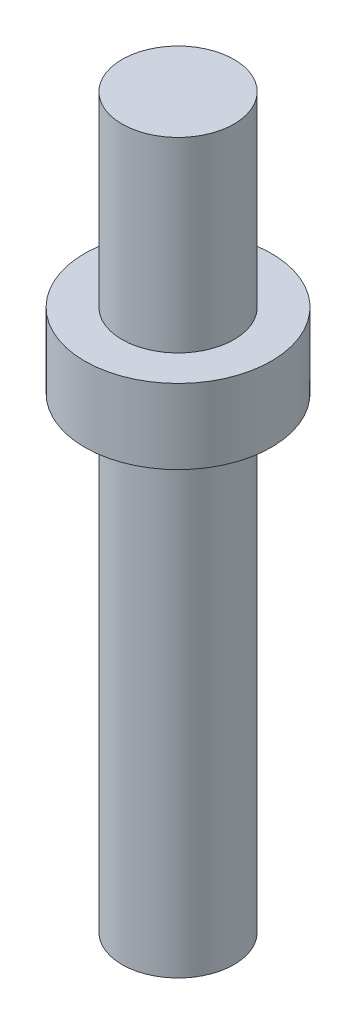
ISO-10303-21;
HEADER;
FILE_DESCRIPTION(('STEP AP214'),'2;1');
FILE_NAME('part.step','',(''),(''),'','','');
FILE_SCHEMA(('AUTOMOTIVE_DESIGN { 1 0 10303 214 1 1 1 1 }'));
ENDSEC;
DATA;
#1=APPLICATION_CONTEXT('core data for automotive mechanical design processes');
#2=APPLICATION_PROTOCOL_DEFINITION('international standard','automotive_design',2000,#1);
#3=PRODUCT_CONTEXT('',#1,'mechanical');
#4=PRODUCT('Part','Part','',(#3));
#5=PRODUCT_RELATED_PRODUCT_CATEGORY('part','',(#4));
#6=PRODUCT_DEFINITION_FORMATION('','',#4);
#7=PRODUCT_DEFINITION_CONTEXT('part definition',#1,'design');
#8=PRODUCT_DEFINITION('design','',#6,#7);
#9=PRODUCT_DEFINITION_SHAPE('','',#8);
#10=(LENGTH_UNIT() NAMED_UNIT(*) SI_UNIT(.MILLI.,.METRE.));
#11=(NAMED_UNIT(*) PLANE_ANGLE_UNIT() SI_UNIT($,.RADIAN.));
#12=(NAMED_UNIT(*) SI_UNIT($,.STERADIAN.) SOLID_ANGLE_UNIT());
#13=UNCERTAINTY_MEASURE_WITH_UNIT(LENGTH_MEASURE(1.E-05),#10,'distance_accuracy_value','');
#14=(GEOMETRIC_REPRESENTATION_CONTEXT(3) GLOBAL_UNCERTAINTY_ASSIGNED_CONTEXT((#13)) GLOBAL_UNIT_ASSIGNED_CONTEXT((#10,
#11,#12)) REPRESENTATION_CONTEXT('',''));
#15=CARTESIAN_POINT('',(0.,0.,0.));
#16=DIRECTION('',(0.,0.,1.));
#17=DIRECTION('',(1.,0.,0.));
#18=AXIS2_PLACEMENT_3D('',#15,#16,#17);
#19=CARTESIAN_POINT('',(0.,12.5,0.));
#20=DIRECTION('',(0.,-1.,0.));
#21=DIRECTION('',(0.,0.,-1.));
#22=AXIS2_PLACEMENT_3D('',#19,#20,#21);
#23=CYLINDRICAL_SURFACE('',#22,1.5);
#24=CARTESIAN_POINT('',(0.,12.5,0.));
#25=DIRECTION('',(0.,1.,0.));
#26=DIRECTION('',(0.,0.,1.));
#27=AXIS2_PLACEMENT_3D('',#24,#25,#26);
#28=CIRCLE('',#27,1.5);
#29=CARTESIAN_POINT('',(0.,12.5,1.5));
#30=VERTEX_POINT('',#29);
#31=EDGE_CURVE('E44',#30,#30,#28,.T.);
#32=ORIENTED_EDGE('',*,*,#31,.F.);
#33=EDGE_LOOP('',(#32));
#34=FACE_BOUND('',#33,.T.);
#35=CARTESIAN_POINT('',(0.,0.,0.));
#36=DIRECTION('',(0.,1.,0.));
#37=DIRECTION('',(0.,0.,1.));
#38=AXIS2_PLACEMENT_3D('',#35,#36,#37);
#39=CIRCLE('',#38,1.5);
#40=CARTESIAN_POINT('',(0.,0.,1.5));
#41=VERTEX_POINT('',#40);
#42=EDGE_CURVE('E40',#41,#41,#39,.T.);
#43=ORIENTED_EDGE('',*,*,#42,.T.);
#44=EDGE_LOOP('',(#43));
#45=FACE_BOUND('',#44,.T.);
#46=ADVANCED_FACE('F37',(#34,#45),#23,.T.);
#47=CARTESIAN_POINT('',(0.,0.,0.));
#48=DIRECTION('',(0.,1.,0.));
#49=DIRECTION('',(0.,0.,1.));
#50=AXIS2_PLACEMENT_3D('',#47,#48,#49);
#51=PLANE('',#50);
#52=ORIENTED_EDGE('',*,*,#42,.F.);
#53=EDGE_LOOP('',(#52));
#54=FACE_BOUND('',#53,.T.);
#55=ADVANCED_FACE('F79',(#54),#51,.F.);
#56=CARTESIAN_POINT('',(0.,14.5,0.));
#57=DIRECTION('',(0.,-1.,0.));
#58=DIRECTION('',(0.,0.,-1.));
#59=AXIS2_PLACEMENT_3D('',#56,#57,#58);
#60=CYLINDRICAL_SURFACE('',#59,2.5);
#61=CARTESIAN_POINT('',(0.,14.5,0.));
#62=DIRECTION('',(0.,1.,0.));
#63=DIRECTION('',(0.,0.,1.));
#64=AXIS2_PLACEMENT_3D('',#61,#62,#63);
#65=CIRCLE('',#64,2.5);
#66=CARTESIAN_POINT('',(0.,14.5,2.5));
#67=VERTEX_POINT('',#66);
#68=EDGE_CURVE('E52',#67,#67,#65,.T.);
#69=ORIENTED_EDGE('',*,*,#68,.F.);
#70=EDGE_LOOP('',(#69));
#71=FACE_BOUND('',#70,.T.);
#72=CARTESIAN_POINT('',(0.,12.5,0.));
#73=DIRECTION('',(0.,1.,0.));
#74=DIRECTION('',(0.,0.,1.));
#75=AXIS2_PLACEMENT_3D('',#72,#73,#74);
#76=CIRCLE('',#75,2.5);
#77=CARTESIAN_POINT('',(0.,12.5,2.5));
#78=VERTEX_POINT('',#77);
#79=EDGE_CURVE('E55',#78,#78,#76,.T.);
#80=ORIENTED_EDGE('',*,*,#79,.T.);
#81=EDGE_LOOP('',(#80));
#82=FACE_BOUND('',#81,.T.);
#83=ADVANCED_FACE('F84',(#71,#82),#60,.T.);
#84=CARTESIAN_POINT('',(0.,14.5,0.));
#85=DIRECTION('',(0.,1.,0.));
#86=DIRECTION('',(0.,0.,1.));
#87=AXIS2_PLACEMENT_3D('',#84,#85,#86);
#88=PLANE('',#87);
#89=CARTESIAN_POINT('',(0.,14.5,0.));
#90=DIRECTION('',(0.,1.,0.));
#91=DIRECTION('',(0.,0.,1.));
#92=AXIS2_PLACEMENT_3D('',#89,#90,#91);
#93=CIRCLE('',#92,1.5);
#94=CARTESIAN_POINT('',(0.,14.5,1.5));
#95=VERTEX_POINT('',#94);
#96=EDGE_CURVE('E10',#95,#95,#93,.T.);
#97=ORIENTED_EDGE('',*,*,#96,.F.);
#98=EDGE_LOOP('',(#97));
#99=FACE_BOUND('',#98,.T.);
#100=ORIENTED_EDGE('',*,*,#68,.T.);
#101=EDGE_LOOP('',(#100));
#102=FACE_BOUND('',#101,.T.);
#103=ADVANCED_FACE('F74',(#99,#102),#88,.T.);
#104=CARTESIAN_POINT('',(0.,12.5,0.));
#105=DIRECTION('',(0.,1.,0.));
#106=DIRECTION('',(0.,0.,1.));
#107=AXIS2_PLACEMENT_3D('',#104,#105,#106);
#108=PLANE('',#107);
#109=ORIENTED_EDGE('',*,*,#31,.T.);
#110=EDGE_LOOP('',(#109));
#111=FACE_BOUND('',#110,.T.);
#112=ORIENTED_EDGE('',*,*,#79,.F.);
#113=EDGE_LOOP('',(#112));
#114=FACE_BOUND('',#113,.T.);
#115=ADVANCED_FACE('F66',(#111,#114),#108,.F.);
#116=CARTESIAN_POINT('',(0.,19.5,0.));
#117=DIRECTION('',(0.,-1.,0.));
#118=DIRECTION('',(0.,0.,-1.));
#119=AXIS2_PLACEMENT_3D('',#116,#117,#118);
#120=CYLINDRICAL_SURFACE('',#119,1.5);
#121=CARTESIAN_POINT('',(0.,19.5,0.));
#122=DIRECTION('',(0.,1.,0.));
#123=DIRECTION('',(0.,0.,1.));
#124=AXIS2_PLACEMENT_3D('',#121,#122,#123);
#125=CIRCLE('',#124,1.5);
#126=CARTESIAN_POINT('',(0.,19.5,1.5));
#127=VERTEX_POINT('',#126);
#128=EDGE_CURVE('E51',#127,#127,#125,.T.);
#129=ORIENTED_EDGE('',*,*,#128,.F.);
#130=EDGE_LOOP('',(#129));
#131=FACE_BOUND('',#130,.T.);
#132=ORIENTED_EDGE('',*,*,#96,.T.);
#133=EDGE_LOOP('',(#132));
#134=FACE_BOUND('',#133,.T.);
#135=ADVANCED_FACE('F64',(#131,#134),#120,.T.);
#136=CARTESIAN_POINT('',(0.,19.5,0.));
#137=DIRECTION('',(0.,1.,0.));
#138=DIRECTION('',(0.,0.,1.));
#139=AXIS2_PLACEMENT_3D('',#136,#137,#138);
#140=PLANE('',#139);
#141=ORIENTED_EDGE('',*,*,#128,.T.);
#142=EDGE_LOOP('',(#141));
#143=FACE_BOUND('',#142,.T.);
#144=ADVANCED_FACE('F62',(#143),#140,.T.);
#145=CLOSED_SHELL('',(#46,#55,#83,#103,#115,#135,#144));
#146=MANIFOLD_SOLID_BREP('B2',#145);
#147=ADVANCED_BREP_SHAPE_REPRESENTATION('',(#18,#146),#14);
#148=SHAPE_DEFINITION_REPRESENTATION(#9,#147);
ENDSEC;
END-ISO-10303-21;
